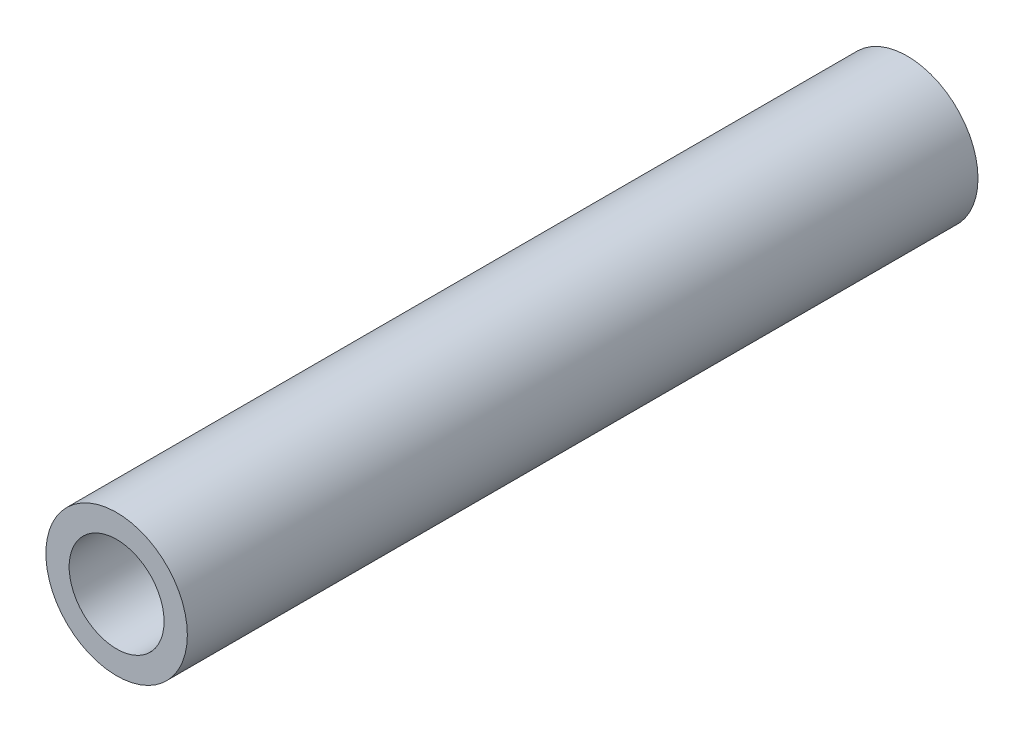
ISO-10303-21;
HEADER;
FILE_DESCRIPTION(('STEP AP214'),'2;1');
FILE_NAME('part.step','',(''),(''),'','','');
FILE_SCHEMA(('AUTOMOTIVE_DESIGN { 1 0 10303 214 1 1 1 1 }'));
ENDSEC;
DATA;
#1=APPLICATION_CONTEXT('core data for automotive mechanical design processes');
#2=APPLICATION_PROTOCOL_DEFINITION('international standard','automotive_design',2000,#1);
#3=PRODUCT_CONTEXT('',#1,'mechanical');
#4=PRODUCT('Part','Part','',(#3));
#5=PRODUCT_RELATED_PRODUCT_CATEGORY('part','',(#4));
#6=PRODUCT_DEFINITION_FORMATION('','',#4);
#7=PRODUCT_DEFINITION_CONTEXT('part definition',#1,'design');
#8=PRODUCT_DEFINITION('design','',#6,#7);
#9=PRODUCT_DEFINITION_SHAPE('','',#8);
#10=(LENGTH_UNIT() NAMED_UNIT(*) SI_UNIT(.MILLI.,.METRE.));
#11=(NAMED_UNIT(*) PLANE_ANGLE_UNIT() SI_UNIT($,.RADIAN.));
#12=(NAMED_UNIT(*) SI_UNIT($,.STERADIAN.) SOLID_ANGLE_UNIT());
#13=UNCERTAINTY_MEASURE_WITH_UNIT(LENGTH_MEASURE(1.E-05),#10,'distance_accuracy_value','');
#14=(GEOMETRIC_REPRESENTATION_CONTEXT(3) GLOBAL_UNCERTAINTY_ASSIGNED_CONTEXT((#13)) GLOBAL_UNIT_ASSIGNED_CONTEXT((#10,
#11,#12)) REPRESENTATION_CONTEXT('',''));
#15=CARTESIAN_POINT('',(0.,0.,0.));
#16=DIRECTION('',(0.,0.,1.));
#17=DIRECTION('',(1.,0.,0.));
#18=AXIS2_PLACEMENT_3D('',#15,#16,#17);
#19=CARTESIAN_POINT('',(0.,0.,22.24));
#20=DIRECTION('',(0.,0.,1.));
#21=DIRECTION('',(1.,0.,0.));
#22=AXIS2_PLACEMENT_3D('',#19,#20,#21);
#23=PLANE('',#22);
#24=CARTESIAN_POINT('',(0.,0.,22.24));
#25=DIRECTION('',(0.,0.,1.));
#26=DIRECTION('',(1.,0.,0.));
#27=AXIS2_PLACEMENT_3D('',#24,#25,#26);
#28=CIRCLE('',#27,1.99);
#29=CARTESIAN_POINT('',(1.99,0.,22.24));
#30=VERTEX_POINT('',#29);
#31=EDGE_CURVE('E10',#30,#30,#28,.T.);
#32=ORIENTED_EDGE('',*,*,#31,.T.);
#33=EDGE_LOOP('',(#32));
#34=FACE_BOUND('',#33,.T.);
#35=CARTESIAN_POINT('',(0.,0.,22.24));
#36=DIRECTION('',(0.,0.,1.));
#37=DIRECTION('',(1.,0.,0.));
#38=AXIS2_PLACEMENT_3D('',#35,#36,#37);
#39=CIRCLE('',#38,1.335);
#40=CARTESIAN_POINT('',(1.335,0.,22.24));
#41=VERTEX_POINT('',#40);
#42=EDGE_CURVE('E41',#41,#41,#39,.T.);
#43=ORIENTED_EDGE('',*,*,#42,.F.);
#44=EDGE_LOOP('',(#43));
#45=FACE_BOUND('',#44,.T.);
#46=ADVANCED_FACE('F30',(#34,#45),#23,.T.);
#47=CARTESIAN_POINT('',(0.,0.,0.));
#48=DIRECTION('',(0.,0.,1.));
#49=DIRECTION('',(1.,0.,0.));
#50=AXIS2_PLACEMENT_3D('',#47,#48,#49);
#51=PLANE('',#50);
#52=CARTESIAN_POINT('',(0.,0.,0.));
#53=DIRECTION('',(0.,0.,1.));
#54=DIRECTION('',(1.,0.,0.));
#55=AXIS2_PLACEMENT_3D('',#52,#53,#54);
#56=CIRCLE('',#55,1.99);
#57=CARTESIAN_POINT('',(1.99,0.,0.));
#58=VERTEX_POINT('',#57);
#59=EDGE_CURVE('E34',#58,#58,#56,.T.);
#60=ORIENTED_EDGE('',*,*,#59,.F.);
#61=EDGE_LOOP('',(#60));
#62=FACE_BOUND('',#61,.T.);
#63=CARTESIAN_POINT('',(0.,0.,0.));
#64=DIRECTION('',(0.,0.,1.));
#65=DIRECTION('',(1.,0.,0.));
#66=AXIS2_PLACEMENT_3D('',#63,#64,#65);
#67=CIRCLE('',#66,1.335);
#68=CARTESIAN_POINT('',(1.335,0.,0.));
#69=VERTEX_POINT('',#68);
#70=EDGE_CURVE('E43',#69,#69,#67,.T.);
#71=ORIENTED_EDGE('',*,*,#70,.T.);
#72=EDGE_LOOP('',(#71));
#73=FACE_BOUND('',#72,.T.);
#74=ADVANCED_FACE('F53',(#62,#73),#51,.F.);
#75=CARTESIAN_POINT('',(0.,0.,22.24));
#76=DIRECTION('',(0.,0.,-1.));
#77=DIRECTION('',(-1.,0.,0.));
#78=AXIS2_PLACEMENT_3D('',#75,#76,#77);
#79=CYLINDRICAL_SURFACE('',#78,1.99);
#80=ORIENTED_EDGE('',*,*,#31,.F.);
#81=EDGE_LOOP('',(#80));
#82=FACE_BOUND('',#81,.T.);
#83=ORIENTED_EDGE('',*,*,#59,.T.);
#84=EDGE_LOOP('',(#83));
#85=FACE_BOUND('',#84,.T.);
#86=ADVANCED_FACE('F32',(#82,#85),#79,.T.);
#87=CARTESIAN_POINT('',(0.,0.,22.24));
#88=DIRECTION('',(0.,0.,-1.));
#89=DIRECTION('',(-1.,0.,0.));
#90=AXIS2_PLACEMENT_3D('',#87,#88,#89);
#91=CYLINDRICAL_SURFACE('',#90,1.335);
#92=ORIENTED_EDGE('',*,*,#42,.T.);
#93=EDGE_LOOP('',(#92));
#94=FACE_BOUND('',#93,.T.);
#95=ORIENTED_EDGE('',*,*,#70,.F.);
#96=EDGE_LOOP('',(#95));
#97=FACE_BOUND('',#96,.T.);
#98=ADVANCED_FACE('F49',(#94,#97),#91,.F.);
#99=CLOSED_SHELL('',(#46,#74,#86,#98));
#100=MANIFOLD_SOLID_BREP('B2',#99);
#101=ADVANCED_BREP_SHAPE_REPRESENTATION('',(#18,#100),#14);
#102=SHAPE_DEFINITION_REPRESENTATION(#9,#101);
ENDSEC;
END-ISO-10303-21;
